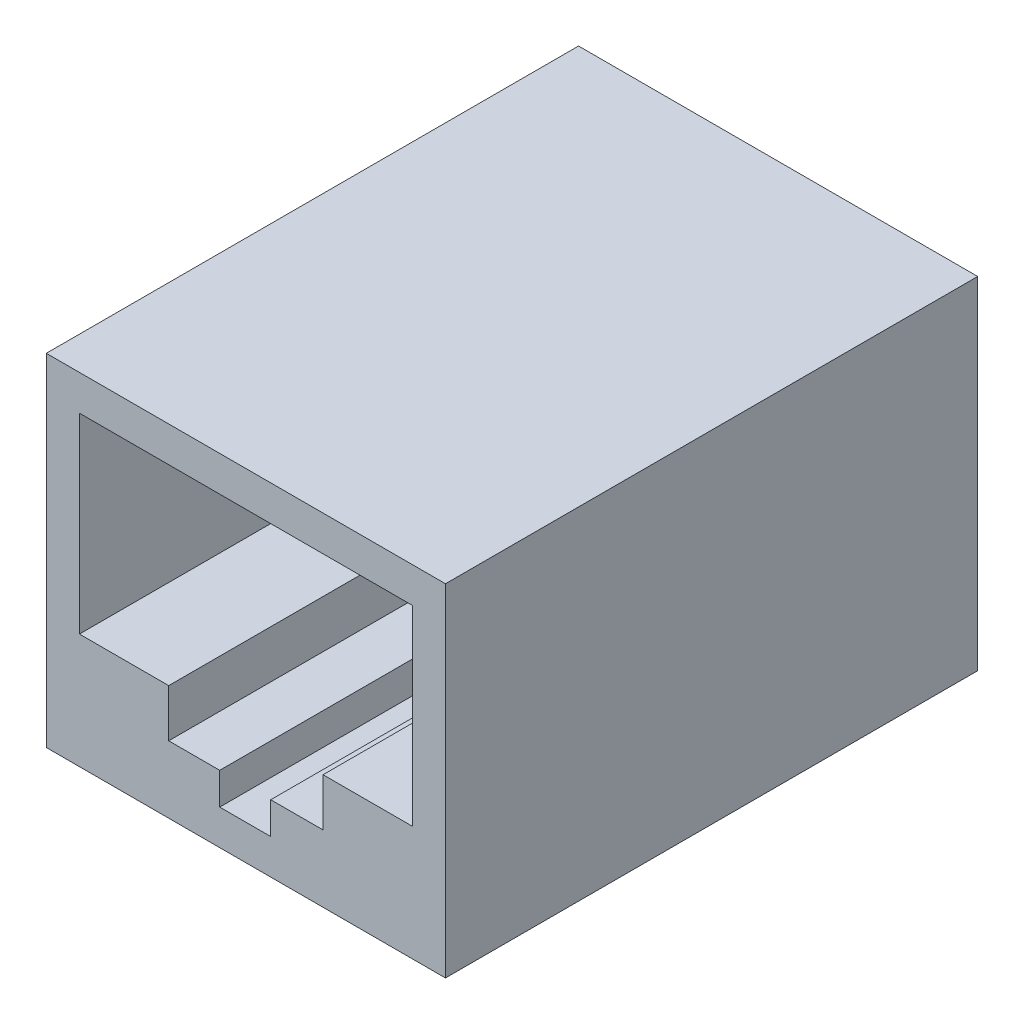
ISO-10303-21;
HEADER;
FILE_DESCRIPTION(('STEP AP214'),'2;1');
FILE_NAME('part.step','',(''),(''),'','','');
FILE_SCHEMA(('AUTOMOTIVE_DESIGN { 1 0 10303 214 1 1 1 1 }'));
ENDSEC;
DATA;
#1=APPLICATION_CONTEXT('core data for automotive mechanical design processes');
#2=APPLICATION_PROTOCOL_DEFINITION('international standard','automotive_design',2000,#1);
#3=PRODUCT_CONTEXT('',#1,'mechanical');
#4=PRODUCT('Part','Part','',(#3));
#5=PRODUCT_RELATED_PRODUCT_CATEGORY('part','',(#4));
#6=PRODUCT_DEFINITION_FORMATION('','',#4);
#7=PRODUCT_DEFINITION_CONTEXT('part definition',#1,'design');
#8=PRODUCT_DEFINITION('design','',#6,#7);
#9=PRODUCT_DEFINITION_SHAPE('','',#8);
#10=(LENGTH_UNIT() NAMED_UNIT(*) SI_UNIT(.MILLI.,.METRE.));
#11=(NAMED_UNIT(*) PLANE_ANGLE_UNIT() SI_UNIT($,.RADIAN.));
#12=(NAMED_UNIT(*) SI_UNIT($,.STERADIAN.) SOLID_ANGLE_UNIT());
#13=UNCERTAINTY_MEASURE_WITH_UNIT(LENGTH_MEASURE(1.E-05),#10,'distance_accuracy_value','');
#14=(GEOMETRIC_REPRESENTATION_CONTEXT(3) GLOBAL_UNCERTAINTY_ASSIGNED_CONTEXT((#13)) GLOBAL_UNIT_ASSIGNED_CONTEXT((#10,
#11,#12)) REPRESENTATION_CONTEXT('',''));
#15=CARTESIAN_POINT('',(0.,0.,0.));
#16=DIRECTION('',(0.,0.,1.));
#17=DIRECTION('',(1.,0.,0.));
#18=AXIS2_PLACEMENT_3D('',#15,#16,#17);
#19=CARTESIAN_POINT('',(0.,0.,-21.2));
#20=DIRECTION('',(-1.,0.,0.));
#21=DIRECTION('',(0.,-1.,0.));
#22=AXIS2_PLACEMENT_3D('',#19,#20,#21);
#23=PLANE('',#22);
#24=DIRECTION('',(0.,-1.,0.));
#25=VECTOR('',#24,1.);
#26=CARTESIAN_POINT('',(0.,0.,0.));
#27=LINE('',#26,#25);
#28=CARTESIAN_POINT('',(0.,13.6,0.));
#29=VERTEX_POINT('',#28);
#30=CARTESIAN_POINT('',(0.,0.,0.));
#31=VERTEX_POINT('',#30);
#32=EDGE_CURVE('E236',#29,#31,#27,.T.);
#33=ORIENTED_EDGE('',*,*,#32,.F.);
#34=DIRECTION('',(0.,0.,1.));
#35=VECTOR('',#34,1.);
#36=CARTESIAN_POINT('',(0.,13.6,-21.2));
#37=LINE('',#36,#35);
#38=CARTESIAN_POINT('',(0.,13.6,-21.2));
#39=VERTEX_POINT('',#38);
#40=EDGE_CURVE('E11',#39,#29,#37,.T.);
#41=ORIENTED_EDGE('',*,*,#40,.F.);
#42=DIRECTION('',(0.,-1.,0.));
#43=VECTOR('',#42,1.);
#44=CARTESIAN_POINT('',(0.,0.,-21.2));
#45=LINE('',#44,#43);
#46=CARTESIAN_POINT('',(0.,0.,-21.2));
#47=VERTEX_POINT('',#46);
#48=EDGE_CURVE('E256',#39,#47,#45,.T.);
#49=ORIENTED_EDGE('',*,*,#48,.T.);
#50=DIRECTION('',(0.,0.,1.));
#51=VECTOR('',#50,1.);
#52=CARTESIAN_POINT('',(0.,0.,-21.2));
#53=LINE('',#52,#51);
#54=EDGE_CURVE('E36',#47,#31,#53,.T.);
#55=ORIENTED_EDGE('',*,*,#54,.T.);
#56=EDGE_LOOP('',(#33,#41,#49,#55));
#57=FACE_BOUND('',#56,.T.);
#58=ADVANCED_FACE('F33',(#57),#23,.T.);
#59=CARTESIAN_POINT('',(0.,13.6,-21.2));
#60=DIRECTION('',(0.,1.,0.));
#61=DIRECTION('',(0.,0.,1.));
#62=AXIS2_PLACEMENT_3D('',#59,#60,#61);
#63=PLANE('',#62);
#64=DIRECTION('',(-1.,0.,0.));
#65=VECTOR('',#64,1.);
#66=CARTESIAN_POINT('',(0.,13.6,0.));
#67=LINE('',#66,#65);
#68=CARTESIAN_POINT('',(15.9,13.6,0.));
#69=VERTEX_POINT('',#68);
#70=EDGE_CURVE('E259',#69,#29,#67,.T.);
#71=ORIENTED_EDGE('',*,*,#70,.F.);
#72=DIRECTION('',(0.,0.,1.));
#73=VECTOR('',#72,1.);
#74=CARTESIAN_POINT('',(15.9,13.6,-21.2));
#75=LINE('',#74,#73);
#76=CARTESIAN_POINT('',(15.9,13.6,-21.2));
#77=VERTEX_POINT('',#76);
#78=EDGE_CURVE('E41',#77,#69,#75,.T.);
#79=ORIENTED_EDGE('',*,*,#78,.F.);
#80=DIRECTION('',(-1.,0.,0.));
#81=VECTOR('',#80,1.);
#82=CARTESIAN_POINT('',(0.,13.6,-21.2));
#83=LINE('',#82,#81);
#84=EDGE_CURVE('E264',#77,#39,#83,.T.);
#85=ORIENTED_EDGE('',*,*,#84,.T.);
#86=ORIENTED_EDGE('',*,*,#40,.T.);
#87=EDGE_LOOP('',(#71,#79,#85,#86));
#88=FACE_BOUND('',#87,.T.);
#89=ADVANCED_FACE('F281',(#88),#63,.T.);
#90=CARTESIAN_POINT('',(15.9,0.,-21.2));
#91=DIRECTION('',(1.,0.,0.));
#92=DIRECTION('',(0.,1.,0.));
#93=AXIS2_PLACEMENT_3D('',#90,#91,#92);
#94=PLANE('',#93);
#95=DIRECTION('',(0.,1.,0.));
#96=VECTOR('',#95,1.);
#97=CARTESIAN_POINT('',(15.9,0.,0.));
#98=LINE('',#97,#96);
#99=CARTESIAN_POINT('',(15.9,0.,0.));
#100=VERTEX_POINT('',#99);
#101=EDGE_CURVE('E271',#100,#69,#98,.T.);
#102=ORIENTED_EDGE('',*,*,#101,.F.);
#103=DIRECTION('',(0.,0.,1.));
#104=VECTOR('',#103,1.);
#105=CARTESIAN_POINT('',(15.9,0.,-21.2));
#106=LINE('',#105,#104);
#107=CARTESIAN_POINT('',(15.9,0.,-21.2));
#108=VERTEX_POINT('',#107);
#109=EDGE_CURVE('E276',#108,#100,#106,.T.);
#110=ORIENTED_EDGE('',*,*,#109,.F.);
#111=DIRECTION('',(0.,1.,0.));
#112=VECTOR('',#111,1.);
#113=CARTESIAN_POINT('',(15.9,0.,-21.2));
#114=LINE('',#113,#112);
#115=EDGE_CURVE('E261',#108,#77,#114,.T.);
#116=ORIENTED_EDGE('',*,*,#115,.T.);
#117=ORIENTED_EDGE('',*,*,#78,.T.);
#118=EDGE_LOOP('',(#102,#110,#116,#117));
#119=FACE_BOUND('',#118,.T.);
#120=ADVANCED_FACE('F285',(#119),#94,.T.);
#121=CARTESIAN_POINT('',(0.,0.,-21.2));
#122=DIRECTION('',(0.,-1.,0.));
#123=DIRECTION('',(0.,0.,-1.));
#124=AXIS2_PLACEMENT_3D('',#121,#122,#123);
#125=PLANE('',#124);
#126=DIRECTION('',(1.,0.,0.));
#127=VECTOR('',#126,1.);
#128=CARTESIAN_POINT('',(0.,0.,0.));
#129=LINE('',#128,#127);
#130=EDGE_CURVE('E268',#31,#100,#129,.T.);
#131=ORIENTED_EDGE('',*,*,#130,.F.);
#132=ORIENTED_EDGE('',*,*,#54,.F.);
#133=DIRECTION('',(1.,0.,0.));
#134=VECTOR('',#133,1.);
#135=CARTESIAN_POINT('',(0.,0.,-21.2));
#136=LINE('',#135,#134);
#137=EDGE_CURVE('E258',#47,#108,#136,.T.);
#138=ORIENTED_EDGE('',*,*,#137,.T.);
#139=ORIENTED_EDGE('',*,*,#109,.T.);
#140=EDGE_LOOP('',(#131,#132,#138,#139));
#141=FACE_BOUND('',#140,.T.);
#142=ADVANCED_FACE('F278',(#141),#125,.T.);
#143=CARTESIAN_POINT('',(0.,13.6,-21.2));
#144=DIRECTION('',(0.,0.,-1.));
#145=DIRECTION('',(-1.,0.,0.));
#146=AXIS2_PLACEMENT_3D('',#143,#144,#145);
#147=PLANE('',#146);
#148=ORIENTED_EDGE('',*,*,#48,.F.);
#149=ORIENTED_EDGE('',*,*,#84,.F.);
#150=ORIENTED_EDGE('',*,*,#115,.F.);
#151=ORIENTED_EDGE('',*,*,#137,.F.);
#152=EDGE_LOOP('',(#148,#149,#150,#151));
#153=FACE_BOUND('',#152,.T.);
#154=ADVANCED_FACE('F287',(#153),#147,.T.);
#155=CARTESIAN_POINT('',(0.,13.6,0.));
#156=DIRECTION('',(0.,0.,-1.));
#157=DIRECTION('',(-1.,0.,0.));
#158=AXIS2_PLACEMENT_3D('',#155,#156,#157);
#159=PLANE('',#158);
#160=DIRECTION('',(1.,0.,0.));
#161=VECTOR('',#160,1.);
#162=CARTESIAN_POINT('',(1.32,4.57437295010678,0.));
#163=LINE('',#162,#161);
#164=CARTESIAN_POINT('',(1.32,4.57437295010678,0.));
#165=VERTEX_POINT('',#164);
#166=CARTESIAN_POINT('',(4.876,4.57437295010678,0.));
#167=VERTEX_POINT('',#166);
#168=EDGE_CURVE('E206',#165,#167,#163,.T.);
#169=ORIENTED_EDGE('',*,*,#168,.F.);
#170=DIRECTION('',(0.,-1.,0.));
#171=VECTOR('',#170,1.);
#172=CARTESIAN_POINT('',(1.32,12.1943729501068,0.));
#173=LINE('',#172,#171);
#174=CARTESIAN_POINT('',(1.32,12.1943729501068,0.));
#175=VERTEX_POINT('',#174);
#176=EDGE_CURVE('E49',#175,#165,#173,.T.);
#177=ORIENTED_EDGE('',*,*,#176,.F.);
#178=DIRECTION('',(-1.,0.,0.));
#179=VECTOR('',#178,1.);
#180=CARTESIAN_POINT('',(1.32,12.1943729501068,0.));
#181=LINE('',#180,#179);
#182=CARTESIAN_POINT('',(14.58,12.1943729501068,0.));
#183=VERTEX_POINT('',#182);
#184=EDGE_CURVE('E174',#183,#175,#181,.T.);
#185=ORIENTED_EDGE('',*,*,#184,.F.);
#186=DIRECTION('',(0.,1.,0.));
#187=VECTOR('',#186,1.);
#188=CARTESIAN_POINT('',(14.58,12.1943729501068,0.));
#189=LINE('',#188,#187);
#190=CARTESIAN_POINT('',(14.58,4.57437295010678,0.));
#191=VERTEX_POINT('',#190);
#192=EDGE_CURVE('E177',#191,#183,#189,.T.);
#193=ORIENTED_EDGE('',*,*,#192,.F.);
#194=DIRECTION('',(1.,0.,0.));
#195=VECTOR('',#194,1.);
#196=CARTESIAN_POINT('',(11.024,4.57437295010678,0.));
#197=LINE('',#196,#195);
#198=CARTESIAN_POINT('',(11.024,4.57437295010678,0.));
#199=VERTEX_POINT('',#198);
#200=EDGE_CURVE('E229',#199,#191,#197,.T.);
#201=ORIENTED_EDGE('',*,*,#200,.F.);
#202=DIRECTION('',(0.,1.,0.));
#203=VECTOR('',#202,1.);
#204=CARTESIAN_POINT('',(11.024,4.57437295010678,0.));
#205=LINE('',#204,#203);
#206=CARTESIAN_POINT('',(11.024,2.66937295010679,0.));
#207=VERTEX_POINT('',#206);
#208=EDGE_CURVE('E226',#207,#199,#205,.T.);
#209=ORIENTED_EDGE('',*,*,#208,.F.);
#210=DIRECTION('',(1.,0.,0.));
#211=VECTOR('',#210,1.);
#212=CARTESIAN_POINT('',(8.94,2.66937295010679,0.));
#213=LINE('',#212,#211);
#214=CARTESIAN_POINT('',(8.94,2.66937295010679,0.));
#215=VERTEX_POINT('',#214);
#216=EDGE_CURVE('E223',#215,#207,#213,.T.);
#217=ORIENTED_EDGE('',*,*,#216,.F.);
#218=DIRECTION('',(0.,1.,0.));
#219=VECTOR('',#218,1.);
#220=CARTESIAN_POINT('',(8.94,2.66937295010679,0.));
#221=LINE('',#220,#219);
#222=CARTESIAN_POINT('',(8.94,1.39937295010678,0.));
#223=VERTEX_POINT('',#222);
#224=EDGE_CURVE('E220',#223,#215,#221,.T.);
#225=ORIENTED_EDGE('',*,*,#224,.F.);
#226=DIRECTION('',(1.,0.,0.));
#227=VECTOR('',#226,1.);
#228=CARTESIAN_POINT('',(6.908,1.39937295010678,0.));
#229=LINE('',#228,#227);
#230=CARTESIAN_POINT('',(6.908,1.39937295010678,0.));
#231=VERTEX_POINT('',#230);
#232=EDGE_CURVE('E217',#231,#223,#229,.T.);
#233=ORIENTED_EDGE('',*,*,#232,.F.);
#234=DIRECTION('',(0.,-1.,0.));
#235=VECTOR('',#234,1.);
#236=CARTESIAN_POINT('',(6.908,2.66937295010678,0.));
#237=LINE('',#236,#235);
#238=CARTESIAN_POINT('',(6.908,2.66937295010678,0.));
#239=VERTEX_POINT('',#238);
#240=EDGE_CURVE('E214',#239,#231,#237,.T.);
#241=ORIENTED_EDGE('',*,*,#240,.F.);
#242=DIRECTION('',(1.,0.,0.));
#243=VECTOR('',#242,1.);
#244=CARTESIAN_POINT('',(4.876,2.66937295010679,0.));
#245=LINE('',#244,#243);
#246=CARTESIAN_POINT('',(4.876,2.66937295010679,0.));
#247=VERTEX_POINT('',#246);
#248=EDGE_CURVE('E211',#247,#239,#245,.T.);
#249=ORIENTED_EDGE('',*,*,#248,.F.);
#250=DIRECTION('',(0.,-1.,0.));
#251=VECTOR('',#250,1.);
#252=CARTESIAN_POINT('',(4.876,4.57437295010678,0.));
#253=LINE('',#252,#251);
#254=EDGE_CURVE('E208',#167,#247,#253,.T.);
#255=ORIENTED_EDGE('',*,*,#254,.F.);
#256=EDGE_LOOP('',(#169,#177,#185,#193,#201,#209,#217,#225,#233,#241,#249,#255));
#257=FACE_BOUND('',#256,.T.);
#258=ORIENTED_EDGE('',*,*,#32,.T.);
#259=ORIENTED_EDGE('',*,*,#130,.T.);
#260=ORIENTED_EDGE('',*,*,#101,.T.);
#261=ORIENTED_EDGE('',*,*,#70,.T.);
#262=EDGE_LOOP('',(#258,#259,#260,#261));
#263=FACE_BOUND('',#262,.T.);
#264=ADVANCED_FACE('F280',(#257,#263),#159,.F.);
#265=CARTESIAN_POINT('',(1.32,12.1943729501068,-15.24));
#266=DIRECTION('',(-1.,0.,0.));
#267=DIRECTION('',(0.,-1.,0.));
#268=AXIS2_PLACEMENT_3D('',#265,#266,#267);
#269=PLANE('',#268);
#270=ORIENTED_EDGE('',*,*,#176,.T.);
#271=DIRECTION('',(0.,0.,1.));
#272=VECTOR('',#271,1.);
#273=CARTESIAN_POINT('',(1.32,4.57437295010678,-15.24));
#274=LINE('',#273,#272);
#275=CARTESIAN_POINT('',(1.32,4.57437295010678,-15.24));
#276=VERTEX_POINT('',#275);
#277=EDGE_CURVE('E151',#276,#165,#274,.T.);
#278=ORIENTED_EDGE('',*,*,#277,.F.);
#279=DIRECTION('',(0.,-1.,0.));
#280=VECTOR('',#279,1.);
#281=CARTESIAN_POINT('',(1.32,12.1943729501068,-15.24));
#282=LINE('',#281,#280);
#283=CARTESIAN_POINT('',(1.32,12.1943729501068,-15.24));
#284=VERTEX_POINT('',#283);
#285=EDGE_CURVE('E155',#284,#276,#282,.T.);
#286=ORIENTED_EDGE('',*,*,#285,.F.);
#287=DIRECTION('',(0.,0.,1.));
#288=VECTOR('',#287,1.);
#289=CARTESIAN_POINT('',(1.32,12.1943729501068,-15.24));
#290=LINE('',#289,#288);
#291=EDGE_CURVE('E234',#284,#175,#290,.T.);
#292=ORIENTED_EDGE('',*,*,#291,.T.);
#293=EDGE_LOOP('',(#270,#278,#286,#292));
#294=FACE_BOUND('',#293,.T.);
#295=ADVANCED_FACE('F153',(#294),#269,.F.);
#296=CARTESIAN_POINT('',(1.32,12.1943729501068,-15.24));
#297=DIRECTION('',(0.,1.,0.));
#298=DIRECTION('',(-1.,0.,0.));
#299=AXIS2_PLACEMENT_3D('',#296,#297,#298);
#300=PLANE('',#299);
#301=ORIENTED_EDGE('',*,*,#184,.T.);
#302=ORIENTED_EDGE('',*,*,#291,.F.);
#303=DIRECTION('',(-1.,0.,0.));
#304=VECTOR('',#303,1.);
#305=CARTESIAN_POINT('',(1.32,12.1943729501068,-15.24));
#306=LINE('',#305,#304);
#307=CARTESIAN_POINT('',(14.58,12.1943729501068,-15.24));
#308=VERTEX_POINT('',#307);
#309=EDGE_CURVE('E161',#308,#284,#306,.T.);
#310=ORIENTED_EDGE('',*,*,#309,.F.);
#311=DIRECTION('',(0.,0.,1.));
#312=VECTOR('',#311,1.);
#313=CARTESIAN_POINT('',(14.58,12.1943729501068,-15.24));
#314=LINE('',#313,#312);
#315=EDGE_CURVE('E237',#308,#183,#314,.T.);
#316=ORIENTED_EDGE('',*,*,#315,.T.);
#317=EDGE_LOOP('',(#301,#302,#310,#316));
#318=FACE_BOUND('',#317,.T.);
#319=ADVANCED_FACE('F331',(#318),#300,.F.);
#320=CARTESIAN_POINT('',(14.58,12.1943729501068,-15.24));
#321=DIRECTION('',(1.,0.,0.));
#322=DIRECTION('',(0.,1.,0.));
#323=AXIS2_PLACEMENT_3D('',#320,#321,#322);
#324=PLANE('',#323);
#325=ORIENTED_EDGE('',*,*,#192,.T.);
#326=ORIENTED_EDGE('',*,*,#315,.F.);
#327=DIRECTION('',(0.,1.,0.));
#328=VECTOR('',#327,1.);
#329=CARTESIAN_POINT('',(14.58,12.1943729501068,-15.24));
#330=LINE('',#329,#328);
#331=CARTESIAN_POINT('',(14.58,4.57437295010678,-15.24));
#332=VERTEX_POINT('',#331);
#333=EDGE_CURVE('E202',#332,#308,#330,.T.);
#334=ORIENTED_EDGE('',*,*,#333,.F.);
#335=DIRECTION('',(0.,0.,1.));
#336=VECTOR('',#335,1.);
#337=CARTESIAN_POINT('',(14.58,4.57437295010678,-15.24));
#338=LINE('',#337,#336);
#339=EDGE_CURVE('E239',#332,#191,#338,.T.);
#340=ORIENTED_EDGE('',*,*,#339,.T.);
#341=EDGE_LOOP('',(#325,#326,#334,#340));
#342=FACE_BOUND('',#341,.T.);
#343=ADVANCED_FACE('F339',(#342),#324,.F.);
#344=CARTESIAN_POINT('',(11.024,4.57437295010678,-15.24));
#345=DIRECTION('',(0.,-1.,0.));
#346=DIRECTION('',(0.,0.,-1.));
#347=AXIS2_PLACEMENT_3D('',#344,#345,#346);
#348=PLANE('',#347);
#349=ORIENTED_EDGE('',*,*,#200,.T.);
#350=ORIENTED_EDGE('',*,*,#339,.F.);
#351=DIRECTION('',(1.,0.,0.));
#352=VECTOR('',#351,1.);
#353=CARTESIAN_POINT('',(11.024,4.57437295010678,-15.24));
#354=LINE('',#353,#352);
#355=CARTESIAN_POINT('',(11.024,4.57437295010678,-15.24));
#356=VERTEX_POINT('',#355);
#357=EDGE_CURVE('E199',#356,#332,#354,.T.);
#358=ORIENTED_EDGE('',*,*,#357,.F.);
#359=DIRECTION('',(0.,0.,1.));
#360=VECTOR('',#359,1.);
#361=CARTESIAN_POINT('',(11.024,4.57437295010678,-15.24));
#362=LINE('',#361,#360);
#363=EDGE_CURVE('E241',#356,#199,#362,.T.);
#364=ORIENTED_EDGE('',*,*,#363,.T.);
#365=EDGE_LOOP('',(#349,#350,#358,#364));
#366=FACE_BOUND('',#365,.T.);
#367=ADVANCED_FACE('F349',(#366),#348,.F.);
#368=CARTESIAN_POINT('',(11.024,4.57437295010678,-15.24));
#369=DIRECTION('',(1.,0.,0.));
#370=DIRECTION('',(0.,0.,-1.));
#371=AXIS2_PLACEMENT_3D('',#368,#369,#370);
#372=PLANE('',#371);
#373=ORIENTED_EDGE('',*,*,#208,.T.);
#374=ORIENTED_EDGE('',*,*,#363,.F.);
#375=DIRECTION('',(0.,1.,0.));
#376=VECTOR('',#375,1.);
#377=CARTESIAN_POINT('',(11.024,4.57437295010678,-15.24));
#378=LINE('',#377,#376);
#379=CARTESIAN_POINT('',(11.024,2.66937295010679,-15.24));
#380=VERTEX_POINT('',#379);
#381=EDGE_CURVE('E196',#380,#356,#378,.T.);
#382=ORIENTED_EDGE('',*,*,#381,.F.);
#383=DIRECTION('',(0.,0.,1.));
#384=VECTOR('',#383,1.);
#385=CARTESIAN_POINT('',(11.024,2.66937295010679,-15.24));
#386=LINE('',#385,#384);
#387=EDGE_CURVE('E243',#380,#207,#386,.T.);
#388=ORIENTED_EDGE('',*,*,#387,.T.);
#389=EDGE_LOOP('',(#373,#374,#382,#388));
#390=FACE_BOUND('',#389,.T.);
#391=ADVANCED_FACE('F359',(#390),#372,.F.);
#392=CARTESIAN_POINT('',(8.94,2.66937295010679,-15.24));
#393=DIRECTION('',(0.,-1.,0.));
#394=DIRECTION('',(0.,0.,-1.));
#395=AXIS2_PLACEMENT_3D('',#392,#393,#394);
#396=PLANE('',#395);
#397=ORIENTED_EDGE('',*,*,#216,.T.);
#398=ORIENTED_EDGE('',*,*,#387,.F.);
#399=DIRECTION('',(1.,0.,0.));
#400=VECTOR('',#399,1.);
#401=CARTESIAN_POINT('',(8.94,2.66937295010679,-15.24));
#402=LINE('',#401,#400);
#403=CARTESIAN_POINT('',(8.94,2.66937295010679,-15.24));
#404=VERTEX_POINT('',#403);
#405=EDGE_CURVE('E193',#404,#380,#402,.T.);
#406=ORIENTED_EDGE('',*,*,#405,.F.);
#407=DIRECTION('',(0.,0.,1.));
#408=VECTOR('',#407,1.);
#409=CARTESIAN_POINT('',(8.94,2.66937295010679,-15.24));
#410=LINE('',#409,#408);
#411=EDGE_CURVE('E245',#404,#215,#410,.T.);
#412=ORIENTED_EDGE('',*,*,#411,.T.);
#413=EDGE_LOOP('',(#397,#398,#406,#412));
#414=FACE_BOUND('',#413,.T.);
#415=ADVANCED_FACE('F369',(#414),#396,.F.);
#416=CARTESIAN_POINT('',(8.94,2.66937295010679,-15.24));
#417=DIRECTION('',(1.,0.,0.));
#418=DIRECTION('',(0.,0.,-1.));
#419=AXIS2_PLACEMENT_3D('',#416,#417,#418);
#420=PLANE('',#419);
#421=ORIENTED_EDGE('',*,*,#224,.T.);
#422=ORIENTED_EDGE('',*,*,#411,.F.);
#423=DIRECTION('',(0.,1.,0.));
#424=VECTOR('',#423,1.);
#425=CARTESIAN_POINT('',(8.94,2.66937295010679,-15.24));
#426=LINE('',#425,#424);
#427=CARTESIAN_POINT('',(8.94,1.39937295010678,-15.24));
#428=VERTEX_POINT('',#427);
#429=EDGE_CURVE('E190',#428,#404,#426,.T.);
#430=ORIENTED_EDGE('',*,*,#429,.F.);
#431=DIRECTION('',(0.,0.,1.));
#432=VECTOR('',#431,1.);
#433=CARTESIAN_POINT('',(8.94,1.39937295010678,-15.24));
#434=LINE('',#433,#432);
#435=EDGE_CURVE('E247',#428,#223,#434,.T.);
#436=ORIENTED_EDGE('',*,*,#435,.T.);
#437=EDGE_LOOP('',(#421,#422,#430,#436));
#438=FACE_BOUND('',#437,.T.);
#439=ADVANCED_FACE('F379',(#438),#420,.F.);
#440=CARTESIAN_POINT('',(6.908,1.39937295010678,-15.24));
#441=DIRECTION('',(0.,-1.,0.));
#442=DIRECTION('',(1.,0.,0.));
#443=AXIS2_PLACEMENT_3D('',#440,#441,#442);
#444=PLANE('',#443);
#445=ORIENTED_EDGE('',*,*,#232,.T.);
#446=ORIENTED_EDGE('',*,*,#435,.F.);
#447=DIRECTION('',(1.,0.,0.));
#448=VECTOR('',#447,1.);
#449=CARTESIAN_POINT('',(6.908,1.39937295010678,-15.24));
#450=LINE('',#449,#448);
#451=CARTESIAN_POINT('',(6.908,1.39937295010678,-15.24));
#452=VERTEX_POINT('',#451);
#453=EDGE_CURVE('E187',#452,#428,#450,.T.);
#454=ORIENTED_EDGE('',*,*,#453,.F.);
#455=DIRECTION('',(0.,0.,1.));
#456=VECTOR('',#455,1.);
#457=CARTESIAN_POINT('',(6.908,1.39937295010678,-15.24));
#458=LINE('',#457,#456);
#459=EDGE_CURVE('E249',#452,#231,#458,.T.);
#460=ORIENTED_EDGE('',*,*,#459,.T.);
#461=EDGE_LOOP('',(#445,#446,#454,#460));
#462=FACE_BOUND('',#461,.T.);
#463=ADVANCED_FACE('F389',(#462),#444,.F.);
#464=CARTESIAN_POINT('',(6.908,2.66937295010678,-15.24));
#465=DIRECTION('',(-1.,0.,0.));
#466=DIRECTION('',(0.,0.,1.));
#467=AXIS2_PLACEMENT_3D('',#464,#465,#466);
#468=PLANE('',#467);
#469=ORIENTED_EDGE('',*,*,#240,.T.);
#470=ORIENTED_EDGE('',*,*,#459,.F.);
#471=DIRECTION('',(0.,-1.,0.));
#472=VECTOR('',#471,1.);
#473=CARTESIAN_POINT('',(6.908,2.66937295010678,-15.24));
#474=LINE('',#473,#472);
#475=CARTESIAN_POINT('',(6.908,2.66937295010678,-15.24));
#476=VERTEX_POINT('',#475);
#477=EDGE_CURVE('E184',#476,#452,#474,.T.);
#478=ORIENTED_EDGE('',*,*,#477,.F.);
#479=DIRECTION('',(0.,0.,1.));
#480=VECTOR('',#479,1.);
#481=CARTESIAN_POINT('',(6.908,2.66937295010678,-15.24));
#482=LINE('',#481,#480);
#483=EDGE_CURVE('E251',#476,#239,#482,.T.);
#484=ORIENTED_EDGE('',*,*,#483,.T.);
#485=EDGE_LOOP('',(#469,#470,#478,#484));
#486=FACE_BOUND('',#485,.T.);
#487=ADVANCED_FACE('F399',(#486),#468,.F.);
#488=CARTESIAN_POINT('',(4.876,2.66937295010679,-15.24));
#489=DIRECTION('',(0.,-1.,0.));
#490=DIRECTION('',(1.,0.,0.));
#491=AXIS2_PLACEMENT_3D('',#488,#489,#490);
#492=PLANE('',#491);
#493=ORIENTED_EDGE('',*,*,#248,.T.);
#494=ORIENTED_EDGE('',*,*,#483,.F.);
#495=DIRECTION('',(1.,0.,0.));
#496=VECTOR('',#495,1.);
#497=CARTESIAN_POINT('',(4.876,2.66937295010679,-15.24));
#498=LINE('',#497,#496);
#499=CARTESIAN_POINT('',(4.876,2.66937295010679,-15.24));
#500=VERTEX_POINT('',#499);
#501=EDGE_CURVE('E181',#500,#476,#498,.T.);
#502=ORIENTED_EDGE('',*,*,#501,.F.);
#503=DIRECTION('',(0.,0.,1.));
#504=VECTOR('',#503,1.);
#505=CARTESIAN_POINT('',(4.876,2.66937295010679,-15.24));
#506=LINE('',#505,#504);
#507=EDGE_CURVE('E253',#500,#247,#506,.T.);
#508=ORIENTED_EDGE('',*,*,#507,.T.);
#509=EDGE_LOOP('',(#493,#494,#502,#508));
#510=FACE_BOUND('',#509,.T.);
#511=ADVANCED_FACE('F409',(#510),#492,.F.);
#512=CARTESIAN_POINT('',(4.876,4.57437295010678,-15.24));
#513=DIRECTION('',(-1.,0.,0.));
#514=DIRECTION('',(0.,0.,1.));
#515=AXIS2_PLACEMENT_3D('',#512,#513,#514);
#516=PLANE('',#515);
#517=ORIENTED_EDGE('',*,*,#254,.T.);
#518=ORIENTED_EDGE('',*,*,#507,.F.);
#519=DIRECTION('',(0.,-1.,0.));
#520=VECTOR('',#519,1.);
#521=CARTESIAN_POINT('',(4.876,4.57437295010678,-15.24));
#522=LINE('',#521,#520);
#523=CARTESIAN_POINT('',(4.876,4.57437295010678,-15.24));
#524=VERTEX_POINT('',#523);
#525=EDGE_CURVE('E169',#524,#500,#522,.T.);
#526=ORIENTED_EDGE('',*,*,#525,.F.);
#527=DIRECTION('',(0.,0.,1.));
#528=VECTOR('',#527,1.);
#529=CARTESIAN_POINT('',(4.876,4.57437295010678,-15.24));
#530=LINE('',#529,#528);
#531=EDGE_CURVE('E160',#524,#167,#530,.T.);
#532=ORIENTED_EDGE('',*,*,#531,.T.);
#533=EDGE_LOOP('',(#517,#518,#526,#532));
#534=FACE_BOUND('',#533,.T.);
#535=ADVANCED_FACE('F419',(#534),#516,.F.);
#536=CARTESIAN_POINT('',(1.32,4.57437295010678,-15.24));
#537=DIRECTION('',(0.,-1.,0.));
#538=DIRECTION('',(0.,0.,-1.));
#539=AXIS2_PLACEMENT_3D('',#536,#537,#538);
#540=PLANE('',#539);
#541=ORIENTED_EDGE('',*,*,#168,.T.);
#542=ORIENTED_EDGE('',*,*,#531,.F.);
#543=DIRECTION('',(1.,0.,0.));
#544=VECTOR('',#543,1.);
#545=CARTESIAN_POINT('',(1.32,4.57437295010678,-15.24));
#546=LINE('',#545,#544);
#547=EDGE_CURVE('E164',#276,#524,#546,.T.);
#548=ORIENTED_EDGE('',*,*,#547,.F.);
#549=ORIENTED_EDGE('',*,*,#277,.T.);
#550=EDGE_LOOP('',(#541,#542,#548,#549));
#551=FACE_BOUND('',#550,.T.);
#552=ADVANCED_FACE('F165',(#551),#540,.F.);
#553=CARTESIAN_POINT('',(1.32,4.57437295010678,-15.24));
#554=DIRECTION('',(0.,0.,1.));
#555=DIRECTION('',(1.,0.,0.));
#556=AXIS2_PLACEMENT_3D('',#553,#554,#555);
#557=PLANE('',#556);
#558=ORIENTED_EDGE('',*,*,#285,.T.);
#559=ORIENTED_EDGE('',*,*,#547,.T.);
#560=ORIENTED_EDGE('',*,*,#525,.T.);
#561=ORIENTED_EDGE('',*,*,#501,.T.);
#562=ORIENTED_EDGE('',*,*,#477,.T.);
#563=ORIENTED_EDGE('',*,*,#453,.T.);
#564=ORIENTED_EDGE('',*,*,#429,.T.);
#565=ORIENTED_EDGE('',*,*,#405,.T.);
#566=ORIENTED_EDGE('',*,*,#381,.T.);
#567=ORIENTED_EDGE('',*,*,#357,.T.);
#568=ORIENTED_EDGE('',*,*,#333,.T.);
#569=ORIENTED_EDGE('',*,*,#309,.T.);
#570=EDGE_LOOP('',(#558,#559,#560,#561,#562,#563,#564,#565,#566,#567,#568,#569));
#571=FACE_BOUND('',#570,.T.);
#572=ADVANCED_FACE('F171',(#571),#557,.T.);
#573=CLOSED_SHELL('',(#58,#89,#120,#142,#154,#264,#295,#319,#343,#367,#391,#415,#439,#463,#487,
#511,#535,#552,#572));
#574=MANIFOLD_SOLID_BREP('B2',#573);
#575=ADVANCED_BREP_SHAPE_REPRESENTATION('',(#18,#574),#14);
#576=SHAPE_DEFINITION_REPRESENTATION(#9,#575);
ENDSEC;
END-ISO-10303-21;
